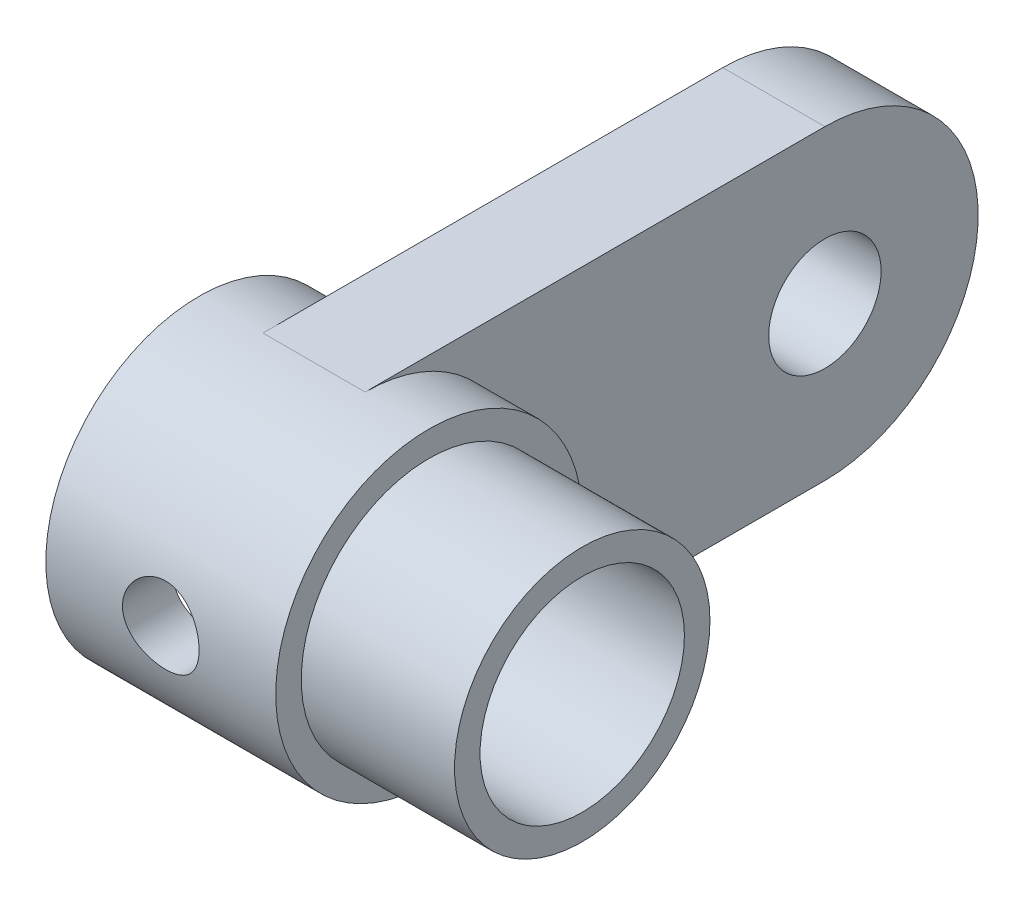
ISO-10303-21;
HEADER;
FILE_DESCRIPTION(('STEP AP214'),'2;1');
FILE_NAME('part.step','',(''),(''),'','','');
FILE_SCHEMA(('AUTOMOTIVE_DESIGN { 1 0 10303 214 1 1 1 1 }'));
ENDSEC;
DATA;
#1=APPLICATION_CONTEXT('core data for automotive mechanical design processes');
#2=APPLICATION_PROTOCOL_DEFINITION('international standard','automotive_design',2000,#1);
#3=PRODUCT_CONTEXT('',#1,'mechanical');
#4=PRODUCT('Part','Part','',(#3));
#5=PRODUCT_RELATED_PRODUCT_CATEGORY('part','',(#4));
#6=PRODUCT_DEFINITION_FORMATION('','',#4);
#7=PRODUCT_DEFINITION_CONTEXT('part definition',#1,'design');
#8=PRODUCT_DEFINITION('design','',#6,#7);
#9=PRODUCT_DEFINITION_SHAPE('','',#8);
#10=(LENGTH_UNIT() NAMED_UNIT(*) SI_UNIT(.MILLI.,.METRE.));
#11=(NAMED_UNIT(*) PLANE_ANGLE_UNIT() SI_UNIT($,.RADIAN.));
#12=(NAMED_UNIT(*) SI_UNIT($,.STERADIAN.) SOLID_ANGLE_UNIT());
#13=UNCERTAINTY_MEASURE_WITH_UNIT(LENGTH_MEASURE(1.E-05),#10,'distance_accuracy_value','');
#14=(GEOMETRIC_REPRESENTATION_CONTEXT(3) GLOBAL_UNCERTAINTY_ASSIGNED_CONTEXT((#13)) GLOBAL_UNIT_ASSIGNED_CONTEXT((#10,
#11,#12)) REPRESENTATION_CONTEXT('',''));
#15=CARTESIAN_POINT('',(0.,0.,0.));
#16=DIRECTION('',(0.,0.,1.));
#17=DIRECTION('',(1.,0.,0.));
#18=AXIS2_PLACEMENT_3D('',#15,#16,#17);
#19=CARTESIAN_POINT('',(-2.,0.,-18.));
#20=DIRECTION('',(-1.,0.,0.));
#21=DIRECTION('',(0.,0.,1.));
#22=AXIS2_PLACEMENT_3D('',#19,#20,#21);
#23=PLANE('',#22);
#24=CARTESIAN_POINT('',(-2.,0.,-18.));
#25=DIRECTION('',(-1.,0.,0.));
#26=DIRECTION('',(0.,0.,1.));
#27=AXIS2_PLACEMENT_3D('',#24,#25,#26);
#28=CIRCLE('',#27,6.);
#29=CARTESIAN_POINT('',(-2.,6.,-18.));
#30=VERTEX_POINT('',#29);
#31=CARTESIAN_POINT('',(-2.,-6.,-18.));
#32=VERTEX_POINT('',#31);
#33=EDGE_CURVE('E223',#30,#32,#28,.T.);
#34=ORIENTED_EDGE('',*,*,#33,.T.);
#35=DIRECTION('',(0.,0.,1.));
#36=VECTOR('',#35,1.);
#37=CARTESIAN_POINT('',(-2.,-6.,0.));
#38=LINE('',#37,#36);
#39=CARTESIAN_POINT('',(-2.,-6.,0.));
#40=VERTEX_POINT('',#39);
#41=EDGE_CURVE('E226',#32,#40,#38,.T.);
#42=ORIENTED_EDGE('',*,*,#41,.T.);
#43=CARTESIAN_POINT('',(-2.,0.,0.));
#44=DIRECTION('',(1.,0.,0.));
#45=DIRECTION('',(0.,0.,1.));
#46=AXIS2_PLACEMENT_3D('',#43,#44,#45);
#47=CIRCLE('',#46,6.);
#48=CARTESIAN_POINT('',(-2.,6.,0.));
#49=VERTEX_POINT('',#48);
#50=EDGE_CURVE('E230',#40,#49,#47,.T.);
#51=ORIENTED_EDGE('',*,*,#50,.T.);
#52=DIRECTION('',(0.,0.,-1.));
#53=VECTOR('',#52,1.);
#54=CARTESIAN_POINT('',(-2.,6.,-18.));
#55=LINE('',#54,#53);
#56=EDGE_CURVE('E125',#49,#30,#55,.T.);
#57=ORIENTED_EDGE('',*,*,#56,.T.);
#58=EDGE_LOOP('',(#34,#42,#51,#57));
#59=FACE_BOUND('',#58,.T.);
#60=CARTESIAN_POINT('',(-2.,0.,-18.));
#61=DIRECTION('',(-1.,0.,0.));
#62=DIRECTION('',(0.,0.,1.));
#63=AXIS2_PLACEMENT_3D('',#60,#61,#62);
#64=CIRCLE('',#63,3.5);
#65=CARTESIAN_POINT('',(-2.,0.,-14.5));
#66=VERTEX_POINT('',#65);
#67=EDGE_CURVE('E200',#66,#66,#64,.T.);
#68=ORIENTED_EDGE('',*,*,#67,.F.);
#69=EDGE_LOOP('',(#68));
#70=FACE_BOUND('',#69,.T.);
#71=ADVANCED_FACE('F95',(#59,#70),#23,.T.);
#72=CARTESIAN_POINT('',(-4.5,0.,-18.));
#73=DIRECTION('',(1.,0.,0.));
#74=DIRECTION('',(0.,0.,-1.));
#75=AXIS2_PLACEMENT_3D('',#72,#73,#74);
#76=CYLINDRICAL_SURFACE('',#75,6.);
#77=DIRECTION('',(1.,0.,0.));
#78=VECTOR('',#77,1.);
#79=CARTESIAN_POINT('',(-4.5,6.,-18.));
#80=LINE('',#79,#78);
#81=CARTESIAN_POINT('',(2.,6.,-18.));
#82=VERTEX_POINT('',#81);
#83=EDGE_CURVE('E243',#30,#82,#80,.T.);
#84=ORIENTED_EDGE('',*,*,#83,.T.);
#85=CARTESIAN_POINT('',(2.,0.,-18.));
#86=DIRECTION('',(-1.,0.,0.));
#87=DIRECTION('',(0.,0.,1.));
#88=AXIS2_PLACEMENT_3D('',#85,#86,#87);
#89=CIRCLE('',#88,6.);
#90=CARTESIAN_POINT('',(2.,-6.,-18.));
#91=VERTEX_POINT('',#90);
#92=EDGE_CURVE('E204',#82,#91,#89,.T.);
#93=ORIENTED_EDGE('',*,*,#92,.T.);
#94=DIRECTION('',(1.,0.,0.));
#95=VECTOR('',#94,1.);
#96=CARTESIAN_POINT('',(-4.5,-6.,-18.));
#97=LINE('',#96,#95);
#98=EDGE_CURVE('E244',#32,#91,#97,.T.);
#99=ORIENTED_EDGE('',*,*,#98,.F.);
#100=ORIENTED_EDGE('',*,*,#33,.F.);
#101=EDGE_LOOP('',(#84,#93,#99,#100));
#102=FACE_BOUND('',#101,.T.);
#103=ADVANCED_FACE('F304',(#102),#76,.T.);
#104=CARTESIAN_POINT('',(-4.5,-6.,0.));
#105=DIRECTION('',(0.,-1.,0.));
#106=DIRECTION('',(0.,0.,-1.));
#107=AXIS2_PLACEMENT_3D('',#104,#105,#106);
#108=PLANE('',#107);
#109=ORIENTED_EDGE('',*,*,#98,.T.);
#110=DIRECTION('',(0.,0.,1.));
#111=VECTOR('',#110,1.);
#112=CARTESIAN_POINT('',(2.,-6.,0.));
#113=LINE('',#112,#111);
#114=CARTESIAN_POINT('',(2.,-6.,0.));
#115=VERTEX_POINT('',#114);
#116=EDGE_CURVE('E215',#91,#115,#113,.T.);
#117=ORIENTED_EDGE('',*,*,#116,.T.);
#118=DIRECTION('',(1.,0.,0.));
#119=VECTOR('',#118,1.);
#120=CARTESIAN_POINT('',(-4.5,-6.,0.));
#121=LINE('',#120,#119);
#122=EDGE_CURVE('E249',#40,#115,#121,.T.);
#123=ORIENTED_EDGE('',*,*,#122,.F.);
#124=ORIENTED_EDGE('',*,*,#41,.F.);
#125=EDGE_LOOP('',(#109,#117,#123,#124));
#126=FACE_BOUND('',#125,.T.);
#127=ADVANCED_FACE('F316',(#126),#108,.T.);
#128=CARTESIAN_POINT('',(-4.5,6.,-18.));
#129=DIRECTION('',(0.,1.,0.));
#130=DIRECTION('',(0.,0.,1.));
#131=AXIS2_PLACEMENT_3D('',#128,#129,#130);
#132=PLANE('',#131);
#133=DIRECTION('',(1.,0.,0.));
#134=VECTOR('',#133,1.);
#135=CARTESIAN_POINT('',(-4.5,6.,0.));
#136=LINE('',#135,#134);
#137=CARTESIAN_POINT('',(2.,6.,0.));
#138=VERTEX_POINT('',#137);
#139=EDGE_CURVE('E253',#49,#138,#136,.T.);
#140=ORIENTED_EDGE('',*,*,#139,.T.);
#141=DIRECTION('',(0.,0.,-1.));
#142=VECTOR('',#141,1.);
#143=CARTESIAN_POINT('',(2.,6.,-18.));
#144=LINE('',#143,#142);
#145=EDGE_CURVE('E208',#138,#82,#144,.T.);
#146=ORIENTED_EDGE('',*,*,#145,.T.);
#147=ORIENTED_EDGE('',*,*,#83,.F.);
#148=ORIENTED_EDGE('',*,*,#56,.F.);
#149=EDGE_LOOP('',(#140,#146,#147,#148));
#150=FACE_BOUND('',#149,.T.);
#151=ADVANCED_FACE('F308',(#150),#132,.T.);
#152=CARTESIAN_POINT('',(6.,0.,-18.));
#153=DIRECTION('',(-1.,0.,0.));
#154=DIRECTION('',(0.,0.,1.));
#155=AXIS2_PLACEMENT_3D('',#152,#153,#154);
#156=CYLINDRICAL_SURFACE('',#155,2.2);
#157=CARTESIAN_POINT('',(2.,0.,-18.));
#158=DIRECTION('',(1.,0.,0.));
#159=DIRECTION('',(0.,0.,-1.));
#160=AXIS2_PLACEMENT_3D('',#157,#158,#159);
#161=CIRCLE('',#160,2.2);
#162=CARTESIAN_POINT('',(2.,0.,-20.2));
#163=VERTEX_POINT('',#162);
#164=EDGE_CURVE('E219',#163,#163,#161,.T.);
#165=ORIENTED_EDGE('',*,*,#164,.T.);
#166=EDGE_LOOP('',(#165));
#167=FACE_BOUND('',#166,.T.);
#168=CARTESIAN_POINT('',(-4.,0.,-18.));
#169=DIRECTION('',(-1.,0.,0.));
#170=DIRECTION('',(0.,0.,1.));
#171=AXIS2_PLACEMENT_3D('',#168,#169,#170);
#172=CIRCLE('',#171,2.2);
#173=CARTESIAN_POINT('',(-4.,0.,-15.8));
#174=VERTEX_POINT('',#173);
#175=EDGE_CURVE('E195',#174,#174,#172,.T.);
#176=ORIENTED_EDGE('',*,*,#175,.T.);
#177=EDGE_LOOP('',(#176));
#178=FACE_BOUND('',#177,.T.);
#179=ADVANCED_FACE('F305',(#167,#178),#156,.F.);
#180=CARTESIAN_POINT('',(4.5,0.,-18.));
#181=DIRECTION('',(1.,0.,0.));
#182=DIRECTION('',(0.,0.,-1.));
#183=AXIS2_PLACEMENT_3D('',#180,#181,#182);
#184=PLANE('',#183);
#185=CARTESIAN_POINT('',(4.5,0.,0.));
#186=DIRECTION('',(1.,0.,0.));
#187=DIRECTION('',(0.,0.,-1.));
#188=AXIS2_PLACEMENT_3D('',#185,#186,#187);
#189=CIRCLE('',#188,5.);
#190=CARTESIAN_POINT('',(4.5,0.,-5.));
#191=VERTEX_POINT('',#190);
#192=EDGE_CURVE('E176',#191,#191,#189,.T.);
#193=ORIENTED_EDGE('',*,*,#192,.F.);
#194=EDGE_LOOP('',(#193));
#195=FACE_BOUND('',#194,.T.);
#196=CARTESIAN_POINT('',(4.5,0.,0.));
#197=DIRECTION('',(1.,0.,0.));
#198=DIRECTION('',(0.,0.,-1.));
#199=AXIS2_PLACEMENT_3D('',#196,#197,#198);
#200=CIRCLE('',#199,6.);
#201=CARTESIAN_POINT('',(4.5,0.,-6.));
#202=VERTEX_POINT('',#201);
#203=EDGE_CURVE('E235',#202,#202,#200,.T.);
#204=ORIENTED_EDGE('',*,*,#203,.T.);
#205=EDGE_LOOP('',(#204));
#206=FACE_BOUND('',#205,.T.);
#207=ADVANCED_FACE('F307',(#195,#206),#184,.T.);
#208=CARTESIAN_POINT('',(-4.5,0.,0.));
#209=DIRECTION('',(1.,0.,0.));
#210=DIRECTION('',(0.,0.,-1.));
#211=AXIS2_PLACEMENT_3D('',#208,#209,#210);
#212=CYLINDRICAL_SURFACE('',#211,6.);
#213=CARTESIAN_POINT('',(1.5,0.,6.));
#214=CARTESIAN_POINT('',(1.49999767426184,0.0828760886697312,5.99999859868012));
#215=CARTESIAN_POINT('',(1.49310844922621,0.165778157830763,5.99826578131828));
#216=CARTESIAN_POINT('',(1.465774848693,0.329206323770533,5.99152113829892));
#217=CARTESIAN_POINT('',(1.44532279046215,0.409731046870739,5.98650745419968));
#218=CARTESIAN_POINT('',(1.39156074653791,0.566020872182577,5.9737562633204));
#219=CARTESIAN_POINT('',(1.35826620128472,0.641791563430003,5.96602202842087));
#220=CARTESIAN_POINT('',(1.27981860995517,0.786672131904427,5.94865343807593));
#221=CARTESIAN_POINT('',(1.23466516388106,0.85578178434876,5.9390190185405));
#222=CARTESIAN_POINT('',(1.13279921034579,0.98680192730092,5.91867413591801));
#223=CARTESIAN_POINT('',(1.07588842504082,1.04855569006107,5.90794707148533));
#224=CARTESIAN_POINT('',(0.952547795091083,1.1617489272033,5.88673620117529));
#225=CARTESIAN_POINT('',(0.886116877053503,1.21318723694914,5.87625242288348));
#226=CARTESIAN_POINT('',(0.744404773262563,1.30502654279903,5.8565477569971));
#227=CARTESIAN_POINT('',(0.669006769189596,1.34525221592536,5.84734794470605));
#228=CARTESIAN_POINT('',(0.51225158834164,1.41239690855053,5.83149494812223));
#229=CARTESIAN_POINT('',(0.430895366674238,1.43931805543933,5.82484135672789));
#230=CARTESIAN_POINT('',(0.266256501797526,1.47855483680429,5.81500476717551));
#231=CARTESIAN_POINT('',(0.183045103950201,1.49115226833334,5.81175491075426));
#232=CARTESIAN_POINT('',(0.0156314309860184,1.50226177506785,5.80889362537741));
#233=CARTESIAN_POINT('',(-0.0685706806986108,1.50077614181798,5.80928160448643));
#234=CARTESIAN_POINT('',(-0.233415807744481,1.48398652463928,5.81359205496618));
#235=CARTESIAN_POINT('',(-0.314095621465097,1.46901834019052,5.81742863001879));
#236=CARTESIAN_POINT('',(-0.471761050911292,1.42622418690311,5.82806709676483));
#237=CARTESIAN_POINT('',(-0.548746403028984,1.39839730206942,5.83486919970696));
#238=CARTESIAN_POINT('',(-0.697738016252066,1.33038947793715,5.85075113904186));
#239=CARTESIAN_POINT('',(-0.769686171789553,1.29008666723291,5.85985327469421));
#240=CARTESIAN_POINT('',(-0.905918709756838,1.19835627601495,5.87929710846386));
#241=CARTESIAN_POINT('',(-0.970201748067256,1.14692674880884,5.88963902334735));
#242=CARTESIAN_POINT('',(-1.0912036156944,1.03266342468122,5.91075880539781));
#243=CARTESIAN_POINT('',(-1.14765449006135,0.96954625816586,5.92154069477971));
#244=CARTESIAN_POINT('',(-1.2492212424639,0.8346119175037,5.94205965578785));
#245=CARTESIAN_POINT('',(-1.29433677426357,0.762794477707944,5.95179669549415));
#246=CARTESIAN_POINT('',(-1.37205058622439,0.612115888681392,5.96917732094182));
#247=CARTESIAN_POINT('',(-1.40460534025443,0.533231393208624,5.97681360127725));
#248=CARTESIAN_POINT('',(-1.45591730570957,0.370876008142883,5.98907916991418));
#249=CARTESIAN_POINT('',(-1.47467715641814,0.287405999150485,5.99370903339281));
#250=CARTESIAN_POINT('',(-1.49745756555884,0.120539970390027,5.99935499271374));
#251=CARTESIAN_POINT('',(-1.5018430260753,0.0371967199882098,6.00046053508278));
#252=CARTESIAN_POINT('',(-1.49675099794451,-0.129032874801508,5.99918804814451));
#253=CARTESIAN_POINT('',(-1.48727475720087,-0.211919259644595,5.99681033241846));
#254=CARTESIAN_POINT('',(-1.45502909160862,-0.373614268776492,5.98889581127357));
#255=CARTESIAN_POINT('',(-1.43245873652301,-0.452465118968755,5.98340634185811));
#256=CARTESIAN_POINT('',(-1.37489291597155,-0.605257292452512,5.96988706634134));
#257=CARTESIAN_POINT('',(-1.33989619568683,-0.679198119032635,5.96185700369892));
#258=CARTESIAN_POINT('',(-1.25776387112527,-0.821523134429847,5.9439330792631));
#259=CARTESIAN_POINT('',(-1.21042388760324,-0.889785441835831,5.93400867366932));
#260=CARTESIAN_POINT('',(-1.10521009120303,-1.01752661364325,5.91344509187419));
#261=CARTESIAN_POINT('',(-1.04733446038309,-1.07700395897301,5.90280579251705));
#262=CARTESIAN_POINT('',(-0.920998039155536,-1.18699056807273,5.88168956960771));
#263=CARTESIAN_POINT('',(-0.852312296997578,-1.23724386762203,5.87122304187281));
#264=CARTESIAN_POINT('',(-0.707267365534283,-1.3255107590127,5.85192878377238));
#265=CARTESIAN_POINT('',(-0.630908517040247,-1.36352489415794,5.84310098067026));
#266=CARTESIAN_POINT('',(-0.473094277586922,-1.42595142060929,5.82818094734665));
#267=CARTESIAN_POINT('',(-0.391672371655991,-1.45044439665407,5.82207255291905));
#268=CARTESIAN_POINT('',(-0.225690362110891,-1.48534565995378,5.81326744090183));
#269=CARTESIAN_POINT('',(-0.141130948967509,-1.49575702747866,5.81056997719936));
#270=CARTESIAN_POINT('',(0.026121023855203,-1.50203859033399,5.80894901203957));
#271=CARTESIAN_POINT('',(0.108797435124731,-1.49831789778012,5.80991932728264));
#272=CARTESIAN_POINT('',(0.272303888667981,-1.47737727831287,5.81527909007842));
#273=CARTESIAN_POINT('',(0.353133968013651,-1.46015762268677,5.81966846891856));
#274=CARTESIAN_POINT('',(0.510208459065409,-1.41293131944279,5.83131260682722));
#275=CARTESIAN_POINT('',(0.586477305240208,-1.38300140468038,5.83855015236309));
#276=CARTESIAN_POINT('',(0.73296538271369,-1.31126491360507,5.85507755724829));
#277=CARTESIAN_POINT('',(0.803183773186917,-1.26945669003419,5.86436770120773));
#278=CARTESIAN_POINT('',(0.937554629002022,-1.17386774863714,5.88425634263512));
#279=CARTESIAN_POINT('',(1.00150107342396,-1.11980316291225,5.89488264831757));
#280=CARTESIAN_POINT('',(1.11954704479541,-1.00178937118973,5.91608027246285));
#281=CARTESIAN_POINT('',(1.17364423011297,-0.937837821261145,5.92665157727059));
#282=CARTESIAN_POINT('',(1.27141130856461,-0.800467586702589,5.94677655647663));
#283=CARTESIAN_POINT('',(1.31487461367158,-0.726898422316386,5.95630833365868));
#284=CARTESIAN_POINT('',(1.38874746294053,-0.573266059510475,5.97304924975118));
#285=CARTESIAN_POINT('',(1.41916636064854,-0.493207563436739,5.98026005199781));
#286=CARTESIAN_POINT('',(1.46157183032965,-0.344410253243471,5.99048059565541));
#287=CARTESIAN_POINT('',(1.47595124305343,-0.276380170908068,5.9940258505269));
#288=CARTESIAN_POINT('',(1.49516594362194,-0.138906071536283,5.99878605231948));
#289=CARTESIAN_POINT('',(1.5000019493053,-0.0694621612426162,6.00000117450894));
#290=CARTESIAN_POINT('',(1.5,0.,6.));
#291=B_SPLINE_CURVE_WITH_KNOTS('',3,(#213,#214,#215,#216,#217,#218,#219,#220,#221,#222,#223,
#224,#225,#226,#227,#228,#229,#230,#231,#232,#233,#234,#235,#236,#237,#238,#239,#240,#241,#242,
#243,#244,#245,#246,#247,#248,#249,#250,#251,#252,#253,#254,#255,#256,#257,#258,#259,#260,#261,
#262,#263,#264,#265,#266,#267,#268,#269,#270,#271,#272,#273,#274,#275,#276,#277,#278,#279,#280,
#281,#282,#283,#284,#285,#286,#287,#288,#289,#290),.UNSPECIFIED.,.T.,.F.,(4,2,2,2,2,2,2,2,2,2,2,
2,2,2,2,2,2,2,2,2,2,2,2,2,2,2,2,2,2,2,2,2,2,2,2,2,2,2,4),(0.,0.24837371247189,0.4968882377639,
0.745104902286106,0.993329940169329,1.24614435437139,1.49898729580062,1.75558647545807,
2.01214461169368,2.2635629509943,2.51494038112697,2.76022497007018,3.00552703466038,
3.25330527873879,3.50112690836163,3.75601500969019,4.01091089558247,4.26668229009114,
4.52240473688643,4.77158308949276,5.02073901112743,5.26620274514037,5.51169127322291,
5.76153587565352,6.01142363008019,6.26744509204476,6.52345518749508,6.77792254614037,
7.03233423252408,7.27943780398613,7.52653640956034,7.77216400559447,8.01782568136901,
8.2698957640991,8.52202569770418,8.77872185499588,9.0352336382135,9.24342242942149,
9.45159556043039),.UNSPECIFIED.);
#292=CARTESIAN_POINT('',(1.5,0.,6.));
#293=VERTEX_POINT('',#292);
#294=EDGE_CURVE('E177',#293,#293,#291,.T.);
#295=ORIENTED_EDGE('',*,*,#294,.F.);
#296=EDGE_LOOP('',(#295));
#297=FACE_BOUND('',#296,.T.);
#298=ORIENTED_EDGE('',*,*,#203,.F.);
#299=EDGE_LOOP('',(#298));
#300=FACE_BOUND('',#299,.T.);
#301=ORIENTED_EDGE('',*,*,#50,.F.);
#302=ORIENTED_EDGE('',*,*,#122,.T.);
#303=CARTESIAN_POINT('',(2.,0.,0.));
#304=DIRECTION('',(1.,0.,0.));
#305=DIRECTION('',(0.,0.,1.));
#306=AXIS2_PLACEMENT_3D('',#303,#304,#305);
#307=CIRCLE('',#306,6.);
#308=EDGE_CURVE('E212',#115,#138,#307,.T.);
#309=ORIENTED_EDGE('',*,*,#308,.T.);
#310=ORIENTED_EDGE('',*,*,#139,.F.);
#311=EDGE_LOOP('',(#301,#302,#309,#310));
#312=FACE_BOUND('',#311,.T.);
#313=CARTESIAN_POINT('',(-4.5,0.,0.));
#314=DIRECTION('',(1.,0.,0.));
#315=DIRECTION('',(0.,0.,-1.));
#316=AXIS2_PLACEMENT_3D('',#313,#314,#315);
#317=CIRCLE('',#316,6.);
#318=CARTESIAN_POINT('',(-4.5,0.,-6.));
#319=VERTEX_POINT('',#318);
#320=EDGE_CURVE('E239',#319,#319,#317,.T.);
#321=ORIENTED_EDGE('',*,*,#320,.T.);
#322=EDGE_LOOP('',(#321));
#323=FACE_BOUND('',#322,.T.);
#324=ADVANCED_FACE('F314',(#297,#300,#312,#323),#212,.T.);
#325=CARTESIAN_POINT('',(-4.5,0.,-18.));
#326=DIRECTION('',(1.,0.,0.));
#327=DIRECTION('',(0.,0.,-1.));
#328=AXIS2_PLACEMENT_3D('',#325,#326,#327);
#329=PLANE('',#328);
#330=CARTESIAN_POINT('',(-4.5,0.,0.));
#331=DIRECTION('',(1.,0.,0.));
#332=DIRECTION('',(0.,0.,-1.));
#333=AXIS2_PLACEMENT_3D('',#330,#331,#332);
#334=CIRCLE('',#333,5.);
#335=CARTESIAN_POINT('',(-4.5,0.,-5.));
#336=VERTEX_POINT('',#335);
#337=EDGE_CURVE('E267',#336,#336,#334,.T.);
#338=ORIENTED_EDGE('',*,*,#337,.T.);
#339=EDGE_LOOP('',(#338));
#340=FACE_BOUND('',#339,.T.);
#341=ORIENTED_EDGE('',*,*,#320,.F.);
#342=EDGE_LOOP('',(#341));
#343=FACE_BOUND('',#342,.T.);
#344=ADVANCED_FACE('F166',(#340,#343),#329,.F.);
#345=CARTESIAN_POINT('',(7.,0.,0.));
#346=DIRECTION('',(-1.,0.,0.));
#347=DIRECTION('',(0.,0.,1.));
#348=AXIS2_PLACEMENT_3D('',#345,#346,#347);
#349=CYLINDRICAL_SURFACE('',#348,4.);
#350=CARTESIAN_POINT('',(1.5,0.,4.));
#351=CARTESIAN_POINT('',(1.50000290230311,0.0812350589378529,4.00000217456151));
#352=CARTESIAN_POINT('',(1.49338023975162,0.162450241781792,3.99750379283184));
#353=CARTESIAN_POINT('',(1.46717180473007,0.322453452352361,3.98778696006928));
#354=CARTESIAN_POINT('',(1.44758789952943,0.401241827987616,3.98056918893993));
#355=CARTESIAN_POINT('',(1.39624699822824,0.554060784990879,3.96218832391545));
#356=CARTESIAN_POINT('',(1.36451348317821,0.628100224162277,3.9510328434944));
#357=CARTESIAN_POINT('',(1.28989358698418,0.769799310160254,3.92588767765353));
#358=CARTESIAN_POINT('',(1.24700421445584,0.837457239177879,3.91189723227548));
#359=CARTESIAN_POINT('',(1.14938746892909,0.967346417045826,3.88186246971217));
#360=CARTESIAN_POINT('',(1.0942697377406,1.02927073015119,3.86576002583566));
#361=CARTESIAN_POINT('',(0.974589565341157,1.14324421474363,3.83360220871327));
#362=CARTESIAN_POINT('',(0.910024243912125,1.19529036359203,3.81754685135033));
#363=CARTESIAN_POINT('',(0.77028253247679,1.28998202215985,3.78662470617731));
#364=CARTESIAN_POINT('',(0.694795633454181,1.3321939319576,3.77182648820818));
#365=CARTESIAN_POINT('',(0.537151645831477,1.40318646334084,3.74599860237433));
#366=CARTESIAN_POINT('',(0.454997236844898,1.43197244961239,3.73496742975881));
#367=CARTESIAN_POINT('',(0.2898832597418,1.47408431017549,3.71854412824136));
#368=CARTESIAN_POINT('',(0.207094961564558,1.48799593218558,3.71293924350838));
#369=CARTESIAN_POINT('',(0.0401838420061581,1.50179556531648,3.70738061461215));
#370=CARTESIAN_POINT('',(-0.0439384138744702,1.5016893680263,3.70742453659305));
#371=CARTESIAN_POINT('',(-0.205769525212957,1.48790429610018,3.71297511632055));
#372=CARTESIAN_POINT('',(-0.283560906044178,1.47503808509003,3.71815468871122));
#373=CARTESIAN_POINT('',(-0.435787150405318,1.4374416786833,3.73284938059529));
#374=CARTESIAN_POINT('',(-0.51022150661388,1.41270969663258,3.74236515298863));
#375=CARTESIAN_POINT('',(-0.655277067728233,1.35163748571904,3.76485702190253));
#376=CARTESIAN_POINT('',(-0.725799486121303,1.31508648737101,3.77789517988166));
#377=CARTESIAN_POINT('',(-0.859945737590972,1.23156073762698,3.80594210139319));
#378=CARTESIAN_POINT('',(-0.9235671775197,1.18458238728897,3.82095154457158));
#379=CARTESIAN_POINT('',(-1.04660366365088,1.07781780766549,3.85248038859113));
#380=CARTESIAN_POINT('',(-1.10544864074809,1.01738298716955,3.86903347455671));
#381=CARTESIAN_POINT('',(-1.2123379662058,0.887312590819021,3.90091728164085));
#382=CARTESIAN_POINT('',(-1.26038065460567,0.817675603497364,3.91624781465952));
#383=CARTESIAN_POINT('',(-1.34493039706252,0.66972343699242,3.9442639480908));
#384=CARTESIAN_POINT('',(-1.38124758122106,0.591290713844719,3.95690498259616));
#385=CARTESIAN_POINT('',(-1.43998260427004,0.428836850524583,3.97778718326962));
#386=CARTESIAN_POINT('',(-1.46240661656112,0.344818210845767,3.98603030341493));
#387=CARTESIAN_POINT('',(-1.49162278754194,0.178375243148665,3.99684443228065));
#388=CARTESIAN_POINT('',(-1.49918260638251,0.0961036195622094,3.99969369025686));
#389=CARTESIAN_POINT('',(-1.50069106389992,-0.0685724752550242,4.00025893700126));
#390=CARTESIAN_POINT('',(-1.49464272031678,-0.150976912983373,3.99797606386863));
#391=CARTESIAN_POINT('',(-1.46968995769133,-0.310262048561859,3.98871709772643));
#392=CARTESIAN_POINT('',(-1.45128845626291,-0.387233328007336,3.98192470962305));
#393=CARTESIAN_POINT('',(-1.40281392745268,-0.536941754957221,3.96451477091717));
#394=CARTESIAN_POINT('',(-1.37273938205196,-0.609678350347534,3.9538967228203));
#395=CARTESIAN_POINT('',(-1.30081358756053,-0.751247765110156,3.92949624407681));
#396=CARTESIAN_POINT('',(-1.25864227077661,-0.819903083557796,3.91563000209348));
#397=CARTESIAN_POINT('',(-1.16408189682844,-0.949392711726626,3.88626671564664));
#398=CARTESIAN_POINT('',(-1.11168906745485,-1.01022412027045,3.87076907009516));
#399=CARTESIAN_POINT('',(-0.994595877875725,-1.12603079874454,3.8387332949099));
#400=CARTESIAN_POINT('',(-0.929357817227302,-1.18046154123569,3.82218696503729));
#401=CARTESIAN_POINT('',(-0.790348615292344,-1.27771050031903,3.79078815746854));
#402=CARTESIAN_POINT('',(-0.7165767086115,-1.32052767414518,3.77593583194399));
#403=CARTESIAN_POINT('',(-0.561984013227687,-1.39337773518998,3.74966829822463));
#404=CARTESIAN_POINT('',(-0.481135254089564,-1.42335685446918,3.73826760328493));
#405=CARTESIAN_POINT('',(-0.314990236312178,-1.46907883466889,3.72054032891005));
#406=CARTESIAN_POINT('',(-0.229696763801877,-1.48483050305535,3.71421061057491));
#407=CARTESIAN_POINT('',(-0.0629838404588851,-1.50086347097839,3.70775894792573));
#408=CARTESIAN_POINT('',(0.0183326317168862,-1.50207331495837,3.70726444523341));
#409=CARTESIAN_POINT('',(0.179945316276166,-1.49136715641593,3.71158412745292));
#410=CARTESIAN_POINT('',(0.260241624671584,-1.47945239850124,3.71639780898899));
#411=CARTESIAN_POINT('',(0.415047226716553,-1.44355815630242,3.73048141585432));
#412=CARTESIAN_POINT('',(0.489658346245346,-1.41995798316524,3.73961085376663));
#413=CARTESIAN_POINT('',(0.633905508494421,-1.3616969677992,3.76121548297845));
#414=CARTESIAN_POINT('',(0.703540288070143,-1.32703332944945,3.77369151995215));
#415=CARTESIAN_POINT('',(0.839826789697632,-1.24552075938154,3.80139723903965));
#416=CARTESIAN_POINT('',(0.906130796799911,-1.1981283280301,3.81673698440964));
#417=CARTESIAN_POINT('',(1.0301415609712,-1.09334485729906,3.84806246757177));
#418=CARTESIAN_POINT('',(1.08784557478675,-1.03595064012808,3.86404840943145));
#419=CARTESIAN_POINT('',(1.19620195582184,-0.909080396784622,3.89590424609881));
#420=CARTESIAN_POINT('',(1.24630375343467,-0.839118644212991,3.91172104900645));
#421=CARTESIAN_POINT('',(1.33402265527656,-0.69121322320082,3.94054514457031));
#422=CARTESIAN_POINT('',(1.37163878773637,-0.61326893409062,3.95355221851559));
#423=CARTESIAN_POINT('',(1.43437682904833,-0.447999082002311,3.9757429260668));
#424=CARTESIAN_POINT('',(1.4588870646019,-0.360413422234208,3.98473657158356));
#425=CARTESIAN_POINT('',(1.49169295992068,-0.181875733606382,3.99686242179587));
#426=CARTESIAN_POINT('',(1.49999675148732,-0.090925416364859,3.99999756603967));
#427=CARTESIAN_POINT('',(1.5,0.,4.));
#428=B_SPLINE_CURVE_WITH_KNOTS('',3,(#350,#351,#352,#353,#354,#355,#356,#357,#358,#359,#360,
#361,#362,#363,#364,#365,#366,#367,#368,#369,#370,#371,#372,#373,#374,#375,#376,#377,#378,#379,
#380,#381,#382,#383,#384,#385,#386,#387,#388,#389,#390,#391,#392,#393,#394,#395,#396,#397,#398,
#399,#400,#401,#402,#403,#404,#405,#406,#407,#408,#409,#410,#411,#412,#413,#414,#415,#416,#417,
#418,#419,#420,#421,#422,#423,#424,#425,#426,#427),.UNSPECIFIED.,.T.,.F.,(4,2,2,2,2,2,2,2,2,2,2,
2,2,2,2,2,2,2,2,2,2,2,2,2,2,2,2,2,2,2,2,2,2,2,2,2,2,2,4),(0.,0.24336980156056,0.48670454953046,
0.729571369213573,0.97250337960949,1.22473618582715,1.47704604925622,1.73896674501659,
2.00078269352134,2.25185874416901,2.50283106079707,2.73878345119971,2.97477138060589,
3.21522408387018,3.45575990744258,3.71246153335813,3.96920257905066,4.22991375286075,
4.49050899698846,4.73725019635925,4.9839366839052,5.2211443792384,5.45838293254453,
5.702592218596,5.94689180019868,6.20536519455658,6.46386178920141,6.72343066727204,
6.98283874956507,7.22558763480252,7.46831350211259,7.70363142426533,7.93900886656506,
8.18672471884271,8.43451941997062,8.69572329654039,8.95694749805102,9.22948515032042,
9.50188601796127),.UNSPECIFIED.);
#429=CARTESIAN_POINT('',(1.5,0.,4.));
#430=VERTEX_POINT('',#429);
#431=EDGE_CURVE('E100',#430,#430,#428,.T.);
#432=ORIENTED_EDGE('',*,*,#431,.T.);
#433=EDGE_LOOP('',(#432));
#434=FACE_BOUND('',#433,.T.);
#435=CARTESIAN_POINT('',(1.5,0.,-4.));
#436=CARTESIAN_POINT('',(1.50000290230311,-0.0812350589378528,-4.00000217456151));
#437=CARTESIAN_POINT('',(1.49338023975162,-0.162450241781792,-3.99750379283184));
#438=CARTESIAN_POINT('',(1.46717180473007,-0.322453452352361,-3.98778696006928));
#439=CARTESIAN_POINT('',(1.44758789952943,-0.401241827987616,-3.98056918893993));
#440=CARTESIAN_POINT('',(1.39624699822824,-0.554060784990879,-3.96218832391545));
#441=CARTESIAN_POINT('',(1.36451348317821,-0.628100224162277,-3.9510328434944));
#442=CARTESIAN_POINT('',(1.28989358698418,-0.769799310160254,-3.92588767765353));
#443=CARTESIAN_POINT('',(1.24700421445584,-0.837457239177879,-3.91189723227548));
#444=CARTESIAN_POINT('',(1.14938746892909,-0.967346417045826,-3.88186246971217));
#445=CARTESIAN_POINT('',(1.0942697377406,-1.02927073015119,-3.86576002583566));
#446=CARTESIAN_POINT('',(0.974589565341157,-1.14324421474363,-3.83360220871327));
#447=CARTESIAN_POINT('',(0.910024243912125,-1.19529036359203,-3.81754685135033));
#448=CARTESIAN_POINT('',(0.77028253247679,-1.28998202215985,-3.78662470617731));
#449=CARTESIAN_POINT('',(0.694795633454181,-1.3321939319576,-3.77182648820818));
#450=CARTESIAN_POINT('',(0.537151645831477,-1.40318646334084,-3.74599860237433));
#451=CARTESIAN_POINT('',(0.454997236844898,-1.43197244961239,-3.73496742975881));
#452=CARTESIAN_POINT('',(0.2898832597418,-1.47408431017549,-3.71854412824136));
#453=CARTESIAN_POINT('',(0.207094961564558,-1.48799593218558,-3.71293924350838));
#454=CARTESIAN_POINT('',(0.0401838420061581,-1.50179556531648,-3.70738061461215));
#455=CARTESIAN_POINT('',(-0.0439384138744702,-1.5016893680263,-3.70742453659305));
#456=CARTESIAN_POINT('',(-0.205769525212957,-1.48790429610018,-3.71297511632055));
#457=CARTESIAN_POINT('',(-0.283560906044178,-1.47503808509003,-3.71815468871122));
#458=CARTESIAN_POINT('',(-0.435787150405318,-1.4374416786833,-3.73284938059529));
#459=CARTESIAN_POINT('',(-0.51022150661388,-1.41270969663258,-3.74236515298863));
#460=CARTESIAN_POINT('',(-0.655277067728233,-1.35163748571904,-3.76485702190253));
#461=CARTESIAN_POINT('',(-0.725799486121303,-1.31508648737101,-3.77789517988166));
#462=CARTESIAN_POINT('',(-0.859945737590972,-1.23156073762698,-3.80594210139319));
#463=CARTESIAN_POINT('',(-0.9235671775197,-1.18458238728897,-3.82095154457158));
#464=CARTESIAN_POINT('',(-1.04660366365088,-1.07781780766549,-3.85248038859113));
#465=CARTESIAN_POINT('',(-1.10544864074809,-1.01738298716955,-3.86903347455671));
#466=CARTESIAN_POINT('',(-1.2123379662058,-0.887312590819021,-3.90091728164085));
#467=CARTESIAN_POINT('',(-1.26038065460567,-0.817675603497364,-3.91624781465952));
#468=CARTESIAN_POINT('',(-1.34493039706252,-0.66972343699242,-3.9442639480908));
#469=CARTESIAN_POINT('',(-1.38124758122106,-0.591290713844719,-3.95690498259616));
#470=CARTESIAN_POINT('',(-1.43998260427004,-0.428836850524583,-3.97778718326962));
#471=CARTESIAN_POINT('',(-1.46240661656112,-0.344818210845767,-3.98603030341493));
#472=CARTESIAN_POINT('',(-1.49162278754194,-0.178375243148665,-3.99684443228065));
#473=CARTESIAN_POINT('',(-1.49918260638251,-0.0961036195622094,-3.99969369025686));
#474=CARTESIAN_POINT('',(-1.50069106389992,0.0685724752550243,-4.00025893700126));
#475=CARTESIAN_POINT('',(-1.49464272031678,0.150976912983373,-3.99797606386863));
#476=CARTESIAN_POINT('',(-1.46968995769133,0.310262048561859,-3.98871709772643));
#477=CARTESIAN_POINT('',(-1.45128845626291,0.387233328007336,-3.98192470962305));
#478=CARTESIAN_POINT('',(-1.40281392745268,0.536941754957221,-3.96451477091717));
#479=CARTESIAN_POINT('',(-1.37273938205196,0.609678350347535,-3.9538967228203));
#480=CARTESIAN_POINT('',(-1.30081358756053,0.751247765110156,-3.92949624407681));
#481=CARTESIAN_POINT('',(-1.25864227077661,0.819903083557796,-3.91563000209348));
#482=CARTESIAN_POINT('',(-1.16408189682844,0.949392711726626,-3.88626671564664));
#483=CARTESIAN_POINT('',(-1.11168906745485,1.01022412027045,-3.87076907009516));
#484=CARTESIAN_POINT('',(-0.994595877875726,1.12603079874454,-3.8387332949099));
#485=CARTESIAN_POINT('',(-0.929357817227302,1.18046154123569,-3.82218696503729));
#486=CARTESIAN_POINT('',(-0.790348615292344,1.27771050031903,-3.79078815746854));
#487=CARTESIAN_POINT('',(-0.7165767086115,1.32052767414518,-3.77593583194399));
#488=CARTESIAN_POINT('',(-0.561984013227687,1.39337773518998,-3.74966829822463));
#489=CARTESIAN_POINT('',(-0.481135254089564,1.42335685446918,-3.73826760328493));
#490=CARTESIAN_POINT('',(-0.314990236312177,1.46907883466889,-3.72054032891005));
#491=CARTESIAN_POINT('',(-0.229696763801877,1.48483050305535,-3.71421061057491));
#492=CARTESIAN_POINT('',(-0.0629838404588853,1.50086347097839,-3.70775894792573));
#493=CARTESIAN_POINT('',(0.0183326317168862,1.50207331495837,-3.70726444523341));
#494=CARTESIAN_POINT('',(0.179945316276166,1.49136715641593,-3.71158412745292));
#495=CARTESIAN_POINT('',(0.260241624671584,1.47945239850124,-3.71639780898899));
#496=CARTESIAN_POINT('',(0.415047226716552,1.44355815630242,-3.73048141585432));
#497=CARTESIAN_POINT('',(0.489658346245346,1.41995798316524,-3.73961085376663));
#498=CARTESIAN_POINT('',(0.633905508494421,1.3616969677992,-3.76121548297845));
#499=CARTESIAN_POINT('',(0.703540288070143,1.32703332944945,-3.77369151995215));
#500=CARTESIAN_POINT('',(0.839826789697632,1.24552075938154,-3.80139723903965));
#501=CARTESIAN_POINT('',(0.906130796799911,1.1981283280301,-3.81673698440964));
#502=CARTESIAN_POINT('',(1.0301415609712,1.09334485729906,-3.84806246757177));
#503=CARTESIAN_POINT('',(1.08784557478675,1.03595064012808,-3.86404840943145));
#504=CARTESIAN_POINT('',(1.19620195582184,0.909080396784622,-3.89590424609881));
#505=CARTESIAN_POINT('',(1.24630375343467,0.839118644212992,-3.91172104900645));
#506=CARTESIAN_POINT('',(1.33402265527656,0.69121322320082,-3.94054514457031));
#507=CARTESIAN_POINT('',(1.37163878773637,0.61326893409062,-3.95355221851559));
#508=CARTESIAN_POINT('',(1.43437682904833,0.447999082002311,-3.9757429260668));
#509=CARTESIAN_POINT('',(1.4588870646019,0.360413422234208,-3.98473657158356));
#510=CARTESIAN_POINT('',(1.49169295992068,0.181875733606382,-3.99686242179587));
#511=CARTESIAN_POINT('',(1.49999675148732,0.0909254163648591,-3.99999756603967));
#512=CARTESIAN_POINT('',(1.5,0.,-4.));
#513=B_SPLINE_CURVE_WITH_KNOTS('',3,(#435,#436,#437,#438,#439,#440,#441,#442,#443,#444,#445,
#446,#447,#448,#449,#450,#451,#452,#453,#454,#455,#456,#457,#458,#459,#460,#461,#462,#463,#464,
#465,#466,#467,#468,#469,#470,#471,#472,#473,#474,#475,#476,#477,#478,#479,#480,#481,#482,#483,
#484,#485,#486,#487,#488,#489,#490,#491,#492,#493,#494,#495,#496,#497,#498,#499,#500,#501,#502,
#503,#504,#505,#506,#507,#508,#509,#510,#511,#512),.UNSPECIFIED.,.T.,.F.,(4,2,2,2,2,2,2,2,2,2,2,
2,2,2,2,2,2,2,2,2,2,2,2,2,2,2,2,2,2,2,2,2,2,2,2,2,2,2,4),(0.,0.24336980156056,0.486704549530461,
0.729571369213573,0.97250337960949,1.22473618582715,1.47704604925622,1.73896674501659,
2.00078269352134,2.25185874416901,2.50283106079707,2.73878345119971,2.97477138060589,
3.21522408387018,3.45575990744259,3.71246153335813,3.96920257905066,4.22991375286075,
4.49050899698846,4.73725019635925,4.98393668390521,5.2211443792384,5.45838293254454,
5.702592218596,5.94689180019868,6.20536519455658,6.46386178920141,6.72343066727204,
6.98283874956507,7.22558763480252,7.46831350211259,7.70363142426533,7.93900886656507,
8.18672471884271,8.43451941997062,8.69572329654039,8.95694749805102,9.22948515032042,
9.50188601796128),.UNSPECIFIED.);
#514=CARTESIAN_POINT('',(-1.5,0.,-4.));
#515=VERTEX_POINT('',#514);
#516=CARTESIAN_POINT('',(1.5,0.,-4.));
#517=VERTEX_POINT('',#516);
#518=EDGE_CURVE('E111',#515,#517,#513,.T.);
#519=ORIENTED_EDGE('',*,*,#518,.T.);
#520=EDGE_CURVE('E12',#517,#515,#513,.T.);
#521=ORIENTED_EDGE('',*,*,#520,.T.);
#522=EDGE_LOOP('',(#519,#521));
#523=FACE_BOUND('',#522,.T.);
#524=CARTESIAN_POINT('',(-3.5,0.,0.));
#525=DIRECTION('',(1.,0.,0.));
#526=DIRECTION('',(0.,0.,-1.));
#527=AXIS2_PLACEMENT_3D('',#524,#525,#526);
#528=CIRCLE('',#527,4.);
#529=CARTESIAN_POINT('',(-3.5,0.,-4.));
#530=VERTEX_POINT('',#529);
#531=EDGE_CURVE('E152',#530,#530,#528,.F.);
#532=ORIENTED_EDGE('',*,*,#531,.T.);
#533=EDGE_LOOP('',(#532));
#534=FACE_BOUND('',#533,.T.);
#535=CARTESIAN_POINT('',(10.5,0.,0.));
#536=DIRECTION('',(1.,0.,0.));
#537=DIRECTION('',(0.,0.,-1.));
#538=AXIS2_PLACEMENT_3D('',#535,#536,#537);
#539=CIRCLE('',#538,4.);
#540=CARTESIAN_POINT('',(10.5,0.,-4.));
#541=VERTEX_POINT('',#540);
#542=EDGE_CURVE('E173',#541,#541,#539,.T.);
#543=ORIENTED_EDGE('',*,*,#542,.T.);
#544=EDGE_LOOP('',(#543));
#545=FACE_BOUND('',#544,.T.);
#546=ADVANCED_FACE('F162',(#434,#523,#534,#545),#349,.F.);
#547=CARTESIAN_POINT('',(2.,0.,-18.));
#548=DIRECTION('',(1.,0.,0.));
#549=DIRECTION('',(0.,0.,1.));
#550=AXIS2_PLACEMENT_3D('',#547,#548,#549);
#551=PLANE('',#550);
#552=ORIENTED_EDGE('',*,*,#164,.F.);
#553=EDGE_LOOP('',(#552));
#554=FACE_BOUND('',#553,.T.);
#555=ORIENTED_EDGE('',*,*,#92,.F.);
#556=ORIENTED_EDGE('',*,*,#145,.F.);
#557=ORIENTED_EDGE('',*,*,#308,.F.);
#558=ORIENTED_EDGE('',*,*,#116,.F.);
#559=EDGE_LOOP('',(#555,#556,#557,#558));
#560=FACE_BOUND('',#559,.T.);
#561=ADVANCED_FACE('F165',(#554,#560),#551,.T.);
#562=CARTESIAN_POINT('',(-4.,0.,-18.));
#563=DIRECTION('',(-1.,0.,0.));
#564=DIRECTION('',(0.,0.,1.));
#565=AXIS2_PLACEMENT_3D('',#562,#563,#564);
#566=PLANE('',#565);
#567=CARTESIAN_POINT('',(-4.,0.,-18.));
#568=DIRECTION('',(-1.,0.,0.));
#569=DIRECTION('',(0.,0.,1.));
#570=AXIS2_PLACEMENT_3D('',#567,#568,#569);
#571=CIRCLE('',#570,3.00000000000001);
#572=CARTESIAN_POINT('',(-4.,0.,-15.));
#573=VERTEX_POINT('',#572);
#574=EDGE_CURVE('E248',#573,#573,#571,.T.);
#575=ORIENTED_EDGE('',*,*,#574,.T.);
#576=EDGE_LOOP('',(#575));
#577=FACE_BOUND('',#576,.T.);
#578=ORIENTED_EDGE('',*,*,#175,.F.);
#579=EDGE_LOOP('',(#578));
#580=FACE_BOUND('',#579,.T.);
#581=ADVANCED_FACE('F292',(#577,#580),#566,.T.);
#582=CARTESIAN_POINT('',(-4.,0.,-18.));
#583=DIRECTION('',(1.,0.,0.));
#584=DIRECTION('',(0.,0.,-1.));
#585=AXIS2_PLACEMENT_3D('',#582,#583,#584);
#586=CYLINDRICAL_SURFACE('',#585,3.5);
#587=CARTESIAN_POINT('',(-3.5,0.,-18.));
#588=DIRECTION('',(-1.,0.,0.));
#589=DIRECTION('',(0.,0.,1.));
#590=AXIS2_PLACEMENT_3D('',#587,#588,#589);
#591=CIRCLE('',#590,3.5);
#592=CARTESIAN_POINT('',(-3.5,0.,-14.5));
#593=VERTEX_POINT('',#592);
#594=EDGE_CURVE('E263',#593,#593,#591,.F.);
#595=ORIENTED_EDGE('',*,*,#594,.T.);
#596=EDGE_LOOP('',(#595));
#597=FACE_BOUND('',#596,.T.);
#598=ORIENTED_EDGE('',*,*,#67,.T.);
#599=EDGE_LOOP('',(#598));
#600=FACE_BOUND('',#599,.T.);
#601=ADVANCED_FACE('F295',(#597,#600),#586,.T.);
#602=CARTESIAN_POINT('',(-4.,0.,-18.));
#603=DIRECTION('',(1.,0.,0.));
#604=DIRECTION('',(0.,0.,-1.));
#605=AXIS2_PLACEMENT_3D('',#602,#603,#604);
#606=CONICAL_SURFACE('',#605,3.00000000000001,0.78539816339744);
#607=ORIENTED_EDGE('',*,*,#594,.F.);
#608=EDGE_LOOP('',(#607));
#609=FACE_BOUND('',#608,.T.);
#610=ORIENTED_EDGE('',*,*,#574,.F.);
#611=EDGE_LOOP('',(#610));
#612=FACE_BOUND('',#611,.T.);
#613=ADVANCED_FACE('F290',(#609,#612),#606,.T.);
#614=CARTESIAN_POINT('',(10.5,0.,0.));
#615=DIRECTION('',(-1.,0.,0.));
#616=DIRECTION('',(0.,0.,1.));
#617=AXIS2_PLACEMENT_3D('',#614,#615,#616);
#618=CYLINDRICAL_SURFACE('',#617,5.);
#619=CARTESIAN_POINT('',(10.5,0.,0.));
#620=DIRECTION('',(1.,0.,0.));
#621=DIRECTION('',(0.,0.,-1.));
#622=AXIS2_PLACEMENT_3D('',#619,#620,#621);
#623=CIRCLE('',#622,5.);
#624=CARTESIAN_POINT('',(10.5,0.,-5.));
#625=VERTEX_POINT('',#624);
#626=EDGE_CURVE('E183',#625,#625,#623,.T.);
#627=ORIENTED_EDGE('',*,*,#626,.F.);
#628=EDGE_LOOP('',(#627));
#629=FACE_BOUND('',#628,.T.);
#630=ORIENTED_EDGE('',*,*,#192,.T.);
#631=EDGE_LOOP('',(#630));
#632=FACE_BOUND('',#631,.T.);
#633=ADVANCED_FACE('F287',(#629,#632),#618,.T.);
#634=CARTESIAN_POINT('',(10.5,0.,0.));
#635=DIRECTION('',(1.,0.,0.));
#636=DIRECTION('',(0.,0.,-1.));
#637=AXIS2_PLACEMENT_3D('',#634,#635,#636);
#638=PLANE('',#637);
#639=ORIENTED_EDGE('',*,*,#542,.F.);
#640=EDGE_LOOP('',(#639));
#641=FACE_BOUND('',#640,.T.);
#642=ORIENTED_EDGE('',*,*,#626,.T.);
#643=EDGE_LOOP('',(#642));
#644=FACE_BOUND('',#643,.T.);
#645=ADVANCED_FACE('F282',(#641,#644),#638,.T.);
#646=CARTESIAN_POINT('',(-4.5,0.,0.));
#647=DIRECTION('',(-1.,0.,0.));
#648=DIRECTION('',(0.,0.,1.));
#649=AXIS2_PLACEMENT_3D('',#646,#647,#648);
#650=CONICAL_SURFACE('',#649,5.,0.785398163397447);
#651=ORIENTED_EDGE('',*,*,#531,.F.);
#652=EDGE_LOOP('',(#651));
#653=FACE_BOUND('',#652,.T.);
#654=ORIENTED_EDGE('',*,*,#337,.F.);
#655=EDGE_LOOP('',(#654));
#656=FACE_BOUND('',#655,.T.);
#657=ADVANCED_FACE('F98',(#653,#656),#650,.F.);
#658=CARTESIAN_POINT('',(0.,0.,-4.));
#659=DIRECTION('',(0.,0.,1.));
#660=DIRECTION('',(1.,0.,0.));
#661=AXIS2_PLACEMENT_3D('',#658,#659,#660);
#662=CYLINDRICAL_SURFACE('',#661,1.5);
#663=ORIENTED_EDGE('',*,*,#294,.T.);
#664=EDGE_LOOP('',(#663));
#665=FACE_BOUND('',#664,.T.);
#666=ORIENTED_EDGE('',*,*,#431,.F.);
#667=EDGE_LOOP('',(#666));
#668=FACE_BOUND('',#667,.T.);
#669=ADVANCED_FACE('F281',(#665,#668),#662,.F.);
#670=CARTESIAN_POINT('',(0.,0.,-4.));
#671=DIRECTION('',(0.,0.,1.));
#672=DIRECTION('',(1.,0.,0.));
#673=AXIS2_PLACEMENT_3D('',#670,#671,#672);
#674=CIRCLE('',#673,1.5);
#675=EDGE_CURVE('E155',#515,#517,#674,.T.);
#676=ORIENTED_EDGE('',*,*,#675,.F.);
#677=ORIENTED_EDGE('',*,*,#520,.F.);
#678=EDGE_LOOP('',(#676,#677));
#679=FACE_BOUND('',#678,.T.);
#680=ADVANCED_FACE('F156',(#679),#662,.F.);
#681=EDGE_CURVE('E117',#517,#515,#674,.T.);
#682=ORIENTED_EDGE('',*,*,#681,.F.);
#683=ORIENTED_EDGE('',*,*,#518,.F.);
#684=EDGE_LOOP('',(#682,#683));
#685=FACE_BOUND('',#684,.T.);
#686=ADVANCED_FACE('F149',(#685),#662,.F.);
#687=CARTESIAN_POINT('',(0.,0.,-4.));
#688=DIRECTION('',(0.,0.,1.));
#689=DIRECTION('',(1.,0.,0.));
#690=AXIS2_PLACEMENT_3D('',#687,#688,#689);
#691=PLANE('',#690);
#692=ORIENTED_EDGE('',*,*,#681,.T.);
#693=ORIENTED_EDGE('',*,*,#675,.T.);
#694=EDGE_LOOP('',(#692,#693));
#695=FACE_BOUND('',#694,.T.);
#696=ADVANCED_FACE('F160',(#695),#691,.T.);
#697=CLOSED_SHELL('',(#71,#103,#127,#151,#179,#207,#324,#344,#546,#561,#581,#601,#613,#633,#645,
#657,#669,#680,#686,#696));
#698=MANIFOLD_SOLID_BREP('B2',#697);
#699=ADVANCED_BREP_SHAPE_REPRESENTATION('',(#18,#698),#14);
#700=SHAPE_DEFINITION_REPRESENTATION(#9,#699);
ENDSEC;
END-ISO-10303-21;
